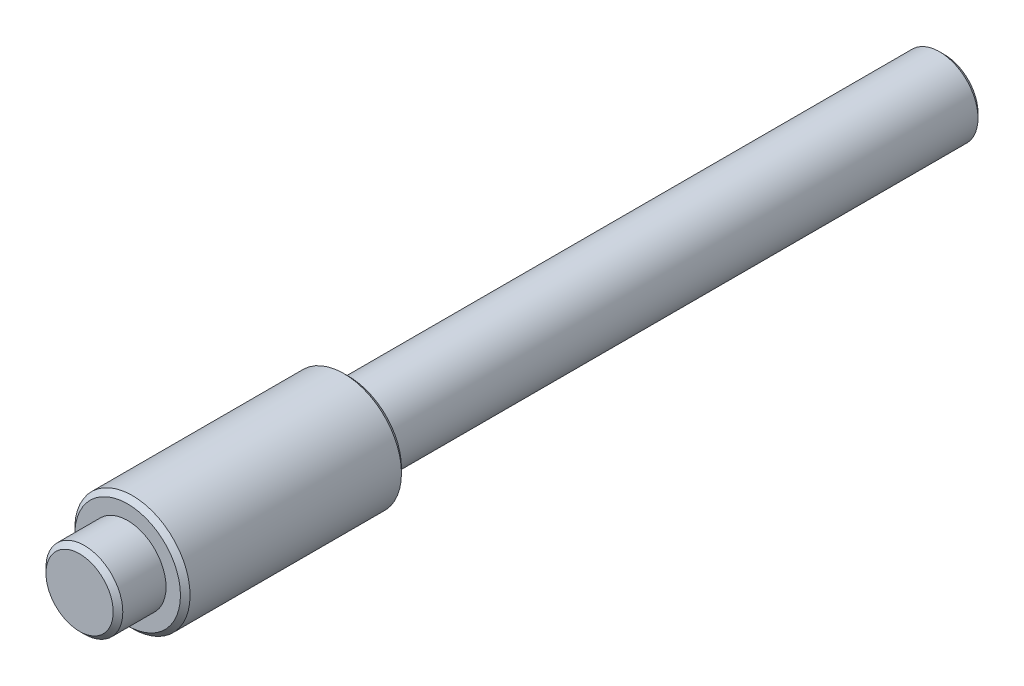
ISO-10303-21;
HEADER;
FILE_DESCRIPTION(('STEP AP214'),'2;1');
FILE_NAME('part.step','',(''),(''),'','','');
FILE_SCHEMA(('AUTOMOTIVE_DESIGN { 1 0 10303 214 1 1 1 1 }'));
ENDSEC;
DATA;
#1=APPLICATION_CONTEXT('core data for automotive mechanical design processes');
#2=APPLICATION_PROTOCOL_DEFINITION('international standard','automotive_design',2000,#1);
#3=PRODUCT_CONTEXT('',#1,'mechanical');
#4=PRODUCT('Part','Part','',(#3));
#5=PRODUCT_RELATED_PRODUCT_CATEGORY('part','',(#4));
#6=PRODUCT_DEFINITION_FORMATION('','',#4);
#7=PRODUCT_DEFINITION_CONTEXT('part definition',#1,'design');
#8=PRODUCT_DEFINITION('design','',#6,#7);
#9=PRODUCT_DEFINITION_SHAPE('','',#8);
#10=(LENGTH_UNIT() NAMED_UNIT(*) SI_UNIT(.MILLI.,.METRE.));
#11=(NAMED_UNIT(*) PLANE_ANGLE_UNIT() SI_UNIT($,.RADIAN.));
#12=(NAMED_UNIT(*) SI_UNIT($,.STERADIAN.) SOLID_ANGLE_UNIT());
#13=UNCERTAINTY_MEASURE_WITH_UNIT(LENGTH_MEASURE(1.E-05),#10,'distance_accuracy_value','');
#14=(GEOMETRIC_REPRESENTATION_CONTEXT(3) GLOBAL_UNCERTAINTY_ASSIGNED_CONTEXT((#13)) GLOBAL_UNIT_ASSIGNED_CONTEXT((#10,
#11,#12)) REPRESENTATION_CONTEXT('',''));
#15=CARTESIAN_POINT('',(0.,0.,0.));
#16=DIRECTION('',(0.,0.,1.));
#17=DIRECTION('',(1.,0.,0.));
#18=AXIS2_PLACEMENT_3D('',#15,#16,#17);
#19=CARTESIAN_POINT('',(0.,0.,0.500000000040967));
#20=DIRECTION('',(0.,0.,1.));
#21=DIRECTION('',(1.,0.,0.));
#22=AXIS2_PLACEMENT_3D('',#19,#20,#21);
#23=CONICAL_SURFACE('',#22,3.99999999998997,0.785398163397448);
#24=CARTESIAN_POINT('',(0.,0.,4.09260162068991E-11));
#25=DIRECTION('',(0.,0.,1.));
#26=DIRECTION('',(1.,0.,0.));
#27=AXIS2_PLACEMENT_3D('',#24,#25,#26);
#28=CIRCLE('',#27,3.49999999998993);
#29=CARTESIAN_POINT('',(3.49999999998991,0.,4.09255945727209E-11));
#30=VERTEX_POINT('',#29);
#31=EDGE_CURVE('E65',#30,#30,#28,.T.);
#32=ORIENTED_EDGE('',*,*,#31,.T.);
#33=EDGE_LOOP('',(#32));
#34=FACE_BOUND('',#33,.T.);
#35=CARTESIAN_POINT('',(0.,0.,0.500000000040967));
#36=DIRECTION('',(0.,0.,1.));
#37=DIRECTION('',(1.,0.,0.));
#38=AXIS2_PLACEMENT_3D('',#35,#36,#37);
#39=CIRCLE('',#38,3.99999999998997);
#40=CARTESIAN_POINT('',(3.99999999998996,0.,0.500000000040967));
#41=VERTEX_POINT('',#40);
#42=EDGE_CURVE('E10',#41,#41,#39,.T.);
#43=ORIENTED_EDGE('',*,*,#42,.F.);
#44=EDGE_LOOP('',(#43));
#45=FACE_BOUND('',#44,.T.);
#46=ADVANCED_FACE('F31',(#34,#45),#23,.T.);
#47=CARTESIAN_POINT('',(0.,0.,4.09260231991006E-11));
#48=DIRECTION('',(0.,0.,1.));
#49=DIRECTION('',(1.,0.,0.));
#50=AXIS2_PLACEMENT_3D('',#47,#48,#49);
#51=CYLINDRICAL_SURFACE('',#50,3.99999999998996);
#52=ORIENTED_EDGE('',*,*,#42,.T.);
#53=EDGE_LOOP('',(#52));
#54=FACE_BOUND('',#53,.T.);
#55=CARTESIAN_POINT('',(0.,0.,62.0000000000205));
#56=DIRECTION('',(0.,0.,1.));
#57=DIRECTION('',(1.,0.,0.));
#58=AXIS2_PLACEMENT_3D('',#55,#56,#57);
#59=CIRCLE('',#58,3.99999999998996);
#60=CARTESIAN_POINT('',(3.99999999998996,0.,62.0000000000205));
#61=VERTEX_POINT('',#60);
#62=EDGE_CURVE('E37',#61,#61,#59,.T.);
#63=ORIENTED_EDGE('',*,*,#62,.F.);
#64=EDGE_LOOP('',(#63));
#65=FACE_BOUND('',#64,.T.);
#66=ADVANCED_FACE('F82',(#54,#65),#51,.T.);
#67=CARTESIAN_POINT('',(5.50000000000587,0.,62.0000000000205));
#68=DIRECTION('',(0.,0.,-1.));
#69=DIRECTION('',(-1.,0.,0.));
#70=AXIS2_PLACEMENT_3D('',#67,#68,#69);
#71=PLANE('',#70);
#72=ORIENTED_EDGE('',*,*,#62,.T.);
#73=EDGE_LOOP('',(#72));
#74=FACE_BOUND('',#73,.T.);
#75=CARTESIAN_POINT('',(0.,0.,62.0000000000205));
#76=DIRECTION('',(0.,0.,1.));
#77=DIRECTION('',(1.,0.,0.));
#78=AXIS2_PLACEMENT_3D('',#75,#76,#77);
#79=CIRCLE('',#78,5.50000000000588);
#80=CARTESIAN_POINT('',(5.50000000000587,0.,62.0000000000205));
#81=VERTEX_POINT('',#80);
#82=EDGE_CURVE('E41',#81,#81,#79,.T.);
#83=ORIENTED_EDGE('',*,*,#82,.F.);
#84=EDGE_LOOP('',(#83));
#85=FACE_BOUND('',#84,.T.);
#86=ADVANCED_FACE('F86',(#74,#85),#71,.T.);
#87=CARTESIAN_POINT('',(0.,0.,62.4999999999861));
#88=DIRECTION('',(0.,0.,1.));
#89=DIRECTION('',(1.,0.,0.));
#90=AXIS2_PLACEMENT_3D('',#87,#88,#89);
#91=CONICAL_SURFACE('',#90,5.99999999997155,0.785398163397452);
#92=ORIENTED_EDGE('',*,*,#82,.T.);
#93=EDGE_LOOP('',(#92));
#94=FACE_BOUND('',#93,.T.);
#95=CARTESIAN_POINT('',(0.,0.,62.4999999999861));
#96=DIRECTION('',(0.,0.,1.));
#97=DIRECTION('',(1.,0.,0.));
#98=AXIS2_PLACEMENT_3D('',#95,#96,#97);
#99=CIRCLE('',#98,5.99999999997155);
#100=CARTESIAN_POINT('',(5.99999999997154,0.,62.4999999999861));
#101=VERTEX_POINT('',#100);
#102=EDGE_CURVE('E45',#101,#101,#99,.T.);
#103=ORIENTED_EDGE('',*,*,#102,.F.);
#104=EDGE_LOOP('',(#103));
#105=FACE_BOUND('',#104,.T.);
#106=ADVANCED_FACE('F90',(#94,#105),#91,.T.);
#107=CARTESIAN_POINT('',(0.,0.,4.09260231991006E-11));
#108=DIRECTION('',(0.,0.,1.));
#109=DIRECTION('',(1.,0.,0.));
#110=AXIS2_PLACEMENT_3D('',#107,#108,#109);
#111=CYLINDRICAL_SURFACE('',#110,5.99999999997154);
#112=ORIENTED_EDGE('',*,*,#102,.T.);
#113=EDGE_LOOP('',(#112));
#114=FACE_BOUND('',#113,.T.);
#115=CARTESIAN_POINT('',(0.,0.,84.4999999999861));
#116=DIRECTION('',(0.,0.,1.));
#117=DIRECTION('',(1.,0.,0.));
#118=AXIS2_PLACEMENT_3D('',#115,#116,#117);
#119=CIRCLE('',#118,5.99999999997154);
#120=CARTESIAN_POINT('',(5.99999999997154,0.,84.4999999999861));
#121=VERTEX_POINT('',#120);
#122=EDGE_CURVE('E50',#121,#121,#119,.T.);
#123=ORIENTED_EDGE('',*,*,#122,.F.);
#124=EDGE_LOOP('',(#123));
#125=FACE_BOUND('',#124,.T.);
#126=ADVANCED_FACE('F96',(#114,#125),#111,.T.);
#127=CARTESIAN_POINT('',(0.,0.,85.0000000000409));
#128=DIRECTION('',(0.,0.,-1.));
#129=DIRECTION('',(-1.,0.,0.));
#130=AXIS2_PLACEMENT_3D('',#127,#128,#129);
#131=CONICAL_SURFACE('',#130,5.49999999991674,0.785398163397447);
#132=ORIENTED_EDGE('',*,*,#122,.T.);
#133=EDGE_LOOP('',(#132));
#134=FACE_BOUND('',#133,.T.);
#135=CARTESIAN_POINT('',(0.,0.,85.0000000000409));
#136=DIRECTION('',(0.,0.,1.));
#137=DIRECTION('',(1.,0.,0.));
#138=AXIS2_PLACEMENT_3D('',#135,#136,#137);
#139=CIRCLE('',#138,5.49999999991674);
#140=CARTESIAN_POINT('',(5.49999999991674,0.,85.0000000000409));
#141=VERTEX_POINT('',#140);
#142=EDGE_CURVE('E53',#141,#141,#139,.T.);
#143=ORIENTED_EDGE('',*,*,#142,.F.);
#144=EDGE_LOOP('',(#143));
#145=FACE_BOUND('',#144,.T.);
#146=ADVANCED_FACE('F100',(#134,#145),#131,.T.);
#147=CARTESIAN_POINT('',(3.99999999998996,0.,85.0000000000409));
#148=DIRECTION('',(0.,0.,1.));
#149=DIRECTION('',(1.,0.,0.));
#150=AXIS2_PLACEMENT_3D('',#147,#148,#149);
#151=PLANE('',#150);
#152=ORIENTED_EDGE('',*,*,#142,.T.);
#153=EDGE_LOOP('',(#152));
#154=FACE_BOUND('',#153,.T.);
#155=CARTESIAN_POINT('',(0.,0.,85.0000000000409));
#156=DIRECTION('',(0.,0.,1.));
#157=DIRECTION('',(1.,0.,0.));
#158=AXIS2_PLACEMENT_3D('',#155,#156,#157);
#159=CIRCLE('',#158,3.99999999998996);
#160=CARTESIAN_POINT('',(3.99999999998996,0.,85.0000000000409));
#161=VERTEX_POINT('',#160);
#162=EDGE_CURVE('E56',#161,#161,#159,.T.);
#163=ORIENTED_EDGE('',*,*,#162,.F.);
#164=EDGE_LOOP('',(#163));
#165=FACE_BOUND('',#164,.T.);
#166=ADVANCED_FACE('F104',(#154,#165),#151,.T.);
#167=CARTESIAN_POINT('',(0.,0.,4.09260231991006E-11));
#168=DIRECTION('',(0.,0.,1.));
#169=DIRECTION('',(1.,0.,0.));
#170=AXIS2_PLACEMENT_3D('',#167,#168,#169);
#171=CYLINDRICAL_SURFACE('',#170,3.99999999998996);
#172=ORIENTED_EDGE('',*,*,#162,.T.);
#173=EDGE_LOOP('',(#172));
#174=FACE_BOUND('',#173,.T.);
#175=CARTESIAN_POINT('',(0.,0.,89.500000000041));
#176=DIRECTION('',(0.,0.,1.));
#177=DIRECTION('',(1.,0.,0.));
#178=AXIS2_PLACEMENT_3D('',#175,#176,#177);
#179=CIRCLE('',#178,3.99999999998996);
#180=CARTESIAN_POINT('',(3.99999999998996,0.,89.500000000041));
#181=VERTEX_POINT('',#180);
#182=EDGE_CURVE('E59',#181,#181,#179,.T.);
#183=ORIENTED_EDGE('',*,*,#182,.F.);
#184=EDGE_LOOP('',(#183));
#185=FACE_BOUND('',#184,.T.);
#186=ADVANCED_FACE('F108',(#174,#185),#171,.T.);
#187=CARTESIAN_POINT('',(0.,0.,90.));
#188=DIRECTION('',(0.,0.,-1.));
#189=DIRECTION('',(-1.,0.,0.));
#190=AXIS2_PLACEMENT_3D('',#187,#188,#189);
#191=CONICAL_SURFACE('',#190,3.50000000003092,0.785398163397448);
#192=ORIENTED_EDGE('',*,*,#182,.T.);
#193=EDGE_LOOP('',(#192));
#194=FACE_BOUND('',#193,.T.);
#195=CARTESIAN_POINT('',(0.,0.,90.));
#196=DIRECTION('',(0.,0.,1.));
#197=DIRECTION('',(1.,0.,0.));
#198=AXIS2_PLACEMENT_3D('',#195,#196,#197);
#199=CIRCLE('',#198,3.50000000003092);
#200=CARTESIAN_POINT('',(3.50000000003092,0.,90.));
#201=VERTEX_POINT('',#200);
#202=EDGE_CURVE('E62',#201,#201,#199,.T.);
#203=ORIENTED_EDGE('',*,*,#202,.F.);
#204=EDGE_LOOP('',(#203));
#205=FACE_BOUND('',#204,.T.);
#206=ADVANCED_FACE('F78',(#194,#205),#191,.T.);
#207=CARTESIAN_POINT('',(0.,0.,90.));
#208=DIRECTION('',(0.,0.,1.));
#209=DIRECTION('',(1.,0.,0.));
#210=AXIS2_PLACEMENT_3D('',#207,#208,#209);
#211=PLANE('',#210);
#212=ORIENTED_EDGE('',*,*,#202,.T.);
#213=EDGE_LOOP('',(#212));
#214=FACE_BOUND('',#213,.T.);
#215=ADVANCED_FACE('F73',(#214),#211,.T.);
#216=CARTESIAN_POINT('',(3.49999999998991,0.,4.09255980688217E-11));
#217=DIRECTION('',(0.,0.,-1.));
#218=DIRECTION('',(-1.,0.,0.));
#219=AXIS2_PLACEMENT_3D('',#216,#217,#218);
#220=PLANE('',#219);
#221=ORIENTED_EDGE('',*,*,#31,.F.);
#222=EDGE_LOOP('',(#221));
#223=FACE_BOUND('',#222,.T.);
#224=ADVANCED_FACE('F71',(#223),#220,.T.);
#225=CLOSED_SHELL('',(#46,#66,#86,#106,#126,#146,#166,#186,#206,#215,#224));
#226=MANIFOLD_SOLID_BREP('B2',#225);
#227=ADVANCED_BREP_SHAPE_REPRESENTATION('',(#18,#226),#14);
#228=SHAPE_DEFINITION_REPRESENTATION(#9,#227);
ENDSEC;
END-ISO-10303-21;
